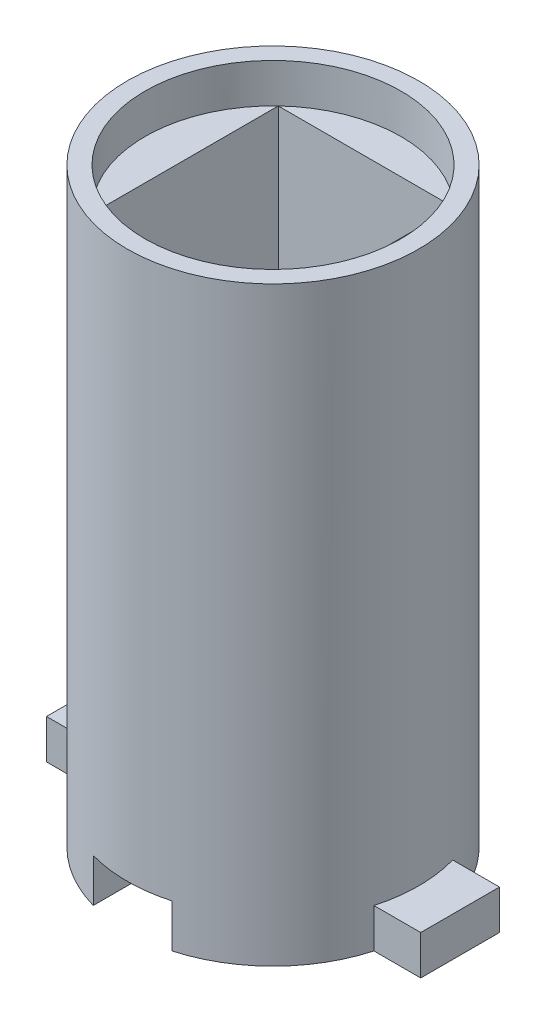
ISO-10303-21;
HEADER;
FILE_DESCRIPTION(('STEP AP214'),'2;1');
FILE_NAME('part.step','',(''),(''),'','','');
FILE_SCHEMA(('AUTOMOTIVE_DESIGN { 1 0 10303 214 1 1 1 1 }'));
ENDSEC;
DATA;
#1=APPLICATION_CONTEXT('core data for automotive mechanical design processes');
#2=APPLICATION_PROTOCOL_DEFINITION('international standard','automotive_design',2000,#1);
#3=PRODUCT_CONTEXT('',#1,'mechanical');
#4=PRODUCT('Part','Part','',(#3));
#5=PRODUCT_RELATED_PRODUCT_CATEGORY('part','',(#4));
#6=PRODUCT_DEFINITION_FORMATION('','',#4);
#7=PRODUCT_DEFINITION_CONTEXT('part definition',#1,'design');
#8=PRODUCT_DEFINITION('design','',#6,#7);
#9=PRODUCT_DEFINITION_SHAPE('','',#8);
#10=(LENGTH_UNIT() NAMED_UNIT(*) SI_UNIT(.MILLI.,.METRE.));
#11=(NAMED_UNIT(*) PLANE_ANGLE_UNIT() SI_UNIT($,.RADIAN.));
#12=(NAMED_UNIT(*) SI_UNIT($,.STERADIAN.) SOLID_ANGLE_UNIT());
#13=UNCERTAINTY_MEASURE_WITH_UNIT(LENGTH_MEASURE(1.E-05),#10,'distance_accuracy_value','');
#14=(GEOMETRIC_REPRESENTATION_CONTEXT(3) GLOBAL_UNCERTAINTY_ASSIGNED_CONTEXT((#13)) GLOBAL_UNIT_ASSIGNED_CONTEXT((#10,
#11,#12)) REPRESENTATION_CONTEXT('',''));
#15=CARTESIAN_POINT('',(0.,0.,0.));
#16=DIRECTION('',(0.,0.,1.));
#17=DIRECTION('',(1.,0.,0.));
#18=AXIS2_PLACEMENT_3D('',#15,#16,#17);
#19=CARTESIAN_POINT('',(0.,140.,0.));
#20=DIRECTION('',(0.,1.,0.));
#21=DIRECTION('',(0.,0.,1.));
#22=AXIS2_PLACEMENT_3D('',#19,#20,#21);
#23=PLANE('',#22);
#24=DIRECTION('',(0.,0.,-1.));
#25=VECTOR('',#24,1.);
#26=CARTESIAN_POINT('',(22.303644928014,140.,-23.6388963982051));
#27=LINE('',#26,#25);
#28=CARTESIAN_POINT('',(22.303644928014,140.,23.6388963982051));
#29=VERTEX_POINT('',#28);
#30=CARTESIAN_POINT('',(22.303644928014,140.,-23.6388963982051));
#31=VERTEX_POINT('',#30);
#32=EDGE_CURVE('E289',#29,#31,#27,.T.);
#33=ORIENTED_EDGE('',*,*,#32,.F.);
#34=CARTESIAN_POINT('',(0.,140.,0.));
#35=DIRECTION('',(0.,1.,0.));
#36=DIRECTION('',(0.,0.,1.));
#37=AXIS2_PLACEMENT_3D('',#34,#35,#36);
#38=CIRCLE('',#37,32.5);
#39=EDGE_CURVE('E322',#29,#31,#38,.T.);
#40=ORIENTED_EDGE('',*,*,#39,.T.);
#41=EDGE_LOOP('',(#33,#40));
#42=FACE_BOUND('',#41,.T.);
#43=ADVANCED_FACE('F39',(#42),#23,.T.);
#44=DIRECTION('',(1.,0.,0.));
#45=VECTOR('',#44,1.);
#46=CARTESIAN_POINT('',(-22.303644928014,140.,23.6388963982051));
#47=LINE('',#46,#45);
#48=CARTESIAN_POINT('',(-22.303644928014,140.,23.6388963982051));
#49=VERTEX_POINT('',#48);
#50=EDGE_CURVE('E294',#49,#29,#47,.T.);
#51=ORIENTED_EDGE('',*,*,#50,.F.);
#52=EDGE_CURVE('E327',#49,#29,#38,.T.);
#53=ORIENTED_EDGE('',*,*,#52,.T.);
#54=EDGE_LOOP('',(#51,#53));
#55=FACE_BOUND('',#54,.T.);
#56=ADVANCED_FACE('F457',(#55),#23,.T.);
#57=DIRECTION('',(0.,0.,1.));
#58=VECTOR('',#57,1.);
#59=CARTESIAN_POINT('',(-22.303644928014,140.,-23.6388963982051));
#60=LINE('',#59,#58);
#61=CARTESIAN_POINT('',(-22.303644928014,140.,-23.6388963982051));
#62=VERTEX_POINT('',#61);
#63=EDGE_CURVE('E308',#62,#49,#60,.T.);
#64=ORIENTED_EDGE('',*,*,#63,.F.);
#65=EDGE_CURVE('E491',#62,#49,#38,.T.);
#66=ORIENTED_EDGE('',*,*,#65,.T.);
#67=EDGE_LOOP('',(#64,#66));
#68=FACE_BOUND('',#67,.T.);
#69=ADVANCED_FACE('F464',(#68),#23,.T.);
#70=CARTESIAN_POINT('',(0.,150.,0.));
#71=DIRECTION('',(0.,-1.,0.));
#72=DIRECTION('',(0.,0.,-1.));
#73=AXIS2_PLACEMENT_3D('',#70,#71,#72);
#74=CYLINDRICAL_SURFACE('',#73,37.);
#75=CARTESIAN_POINT('',(0.,150.,0.));
#76=DIRECTION('',(0.,1.,0.));
#77=DIRECTION('',(0.,0.,1.));
#78=AXIS2_PLACEMENT_3D('',#75,#76,#77);
#79=CIRCLE('',#78,37.);
#80=CARTESIAN_POINT('',(0.,150.,37.));
#81=VERTEX_POINT('',#80);
#82=EDGE_CURVE('E347',#81,#81,#79,.T.);
#83=ORIENTED_EDGE('',*,*,#82,.F.);
#84=EDGE_LOOP('',(#83));
#85=FACE_BOUND('',#84,.T.);
#86=CARTESIAN_POINT('',(0.,11.,0.));
#87=DIRECTION('',(0.,-1.,0.));
#88=DIRECTION('',(0.,0.,-1.));
#89=AXIS2_PLACEMENT_3D('',#86,#87,#88);
#90=CIRCLE('',#89,37.);
#91=CARTESIAN_POINT('',(10.,11.,35.6230262611138));
#92=VERTEX_POINT('',#91);
#93=CARTESIAN_POINT('',(-10.,11.,35.6230262611138));
#94=VERTEX_POINT('',#93);
#95=EDGE_CURVE('E223',#92,#94,#90,.T.);
#96=ORIENTED_EDGE('',*,*,#95,.F.);
#97=DIRECTION('',(0.,-1.,0.));
#98=VECTOR('',#97,1.);
#99=CARTESIAN_POINT('',(10.,150.,35.6230262611138));
#100=LINE('',#99,#98);
#101=CARTESIAN_POINT('',(10.,0.,35.6230262611138));
#102=VERTEX_POINT('',#101);
#103=EDGE_CURVE('E207',#92,#102,#100,.T.);
#104=ORIENTED_EDGE('',*,*,#103,.T.);
#105=CARTESIAN_POINT('',(0.,0.,0.));
#106=DIRECTION('',(0.,1.,0.));
#107=DIRECTION('',(0.,0.,1.));
#108=AXIS2_PLACEMENT_3D('',#105,#106,#107);
#109=CIRCLE('',#108,37.);
#110=CARTESIAN_POINT('',(35.6230262611138,0.,10.));
#111=VERTEX_POINT('',#110);
#112=EDGE_CURVE('E339',#102,#111,#109,.T.);
#113=ORIENTED_EDGE('',*,*,#112,.T.);
#114=DIRECTION('',(0.,-1.,0.));
#115=VECTOR('',#114,1.);
#116=CARTESIAN_POINT('',(35.6230262611138,150.,10.));
#117=LINE('',#116,#115);
#118=CARTESIAN_POINT('',(35.6230262611138,10.,10.));
#119=VERTEX_POINT('',#118);
#120=EDGE_CURVE('E284',#111,#119,#117,.F.);
#121=ORIENTED_EDGE('',*,*,#120,.T.);
#122=CARTESIAN_POINT('',(0.,10.,0.));
#123=DIRECTION('',(0.,1.,0.));
#124=DIRECTION('',(0.,0.,1.));
#125=AXIS2_PLACEMENT_3D('',#122,#123,#124);
#126=CIRCLE('',#125,37.);
#127=CARTESIAN_POINT('',(35.6230262611138,10.,-10.));
#128=VERTEX_POINT('',#127);
#129=EDGE_CURVE('E280',#119,#128,#126,.T.);
#130=ORIENTED_EDGE('',*,*,#129,.T.);
#131=DIRECTION('',(0.,-1.,0.));
#132=VECTOR('',#131,1.);
#133=CARTESIAN_POINT('',(35.6230262611138,150.,-10.));
#134=LINE('',#133,#132);
#135=CARTESIAN_POINT('',(35.6230262611138,0.,-10.));
#136=VERTEX_POINT('',#135);
#137=EDGE_CURVE('E286',#128,#136,#134,.T.);
#138=ORIENTED_EDGE('',*,*,#137,.T.);
#139=CARTESIAN_POINT('',(-35.6230262611138,0.,-10.));
#140=VERTEX_POINT('',#139);
#141=EDGE_CURVE('E351',#136,#140,#109,.T.);
#142=ORIENTED_EDGE('',*,*,#141,.T.);
#143=DIRECTION('',(0.,-1.,0.));
#144=VECTOR('',#143,1.);
#145=CARTESIAN_POINT('',(-35.6230262611138,150.,-10.));
#146=LINE('',#145,#144);
#147=CARTESIAN_POINT('',(-35.6230262611138,10.,-10.));
#148=VERTEX_POINT('',#147);
#149=EDGE_CURVE('E63',#140,#148,#146,.F.);
#150=ORIENTED_EDGE('',*,*,#149,.T.);
#151=CARTESIAN_POINT('',(0.,10.,0.));
#152=DIRECTION('',(0.,-1.,0.));
#153=DIRECTION('',(0.,0.,-1.));
#154=AXIS2_PLACEMENT_3D('',#151,#152,#153);
#155=CIRCLE('',#154,37.);
#156=CARTESIAN_POINT('',(-35.6230262611138,10.,10.));
#157=VERTEX_POINT('',#156);
#158=EDGE_CURVE('E254',#157,#148,#155,.T.);
#159=ORIENTED_EDGE('',*,*,#158,.F.);
#160=DIRECTION('',(0.,-1.,0.));
#161=VECTOR('',#160,1.);
#162=CARTESIAN_POINT('',(-35.6230262611138,150.,10.));
#163=LINE('',#162,#161);
#164=CARTESIAN_POINT('',(-35.6230262611138,0.,10.));
#165=VERTEX_POINT('',#164);
#166=EDGE_CURVE('E258',#157,#165,#163,.T.);
#167=ORIENTED_EDGE('',*,*,#166,.T.);
#168=CARTESIAN_POINT('',(-10.,0.,35.6230262611138));
#169=VERTEX_POINT('',#168);
#170=EDGE_CURVE('E353',#165,#169,#109,.T.);
#171=ORIENTED_EDGE('',*,*,#170,.T.);
#172=DIRECTION('',(0.,-1.,0.));
#173=VECTOR('',#172,1.);
#174=CARTESIAN_POINT('',(-10.,150.,35.6230262611138));
#175=LINE('',#174,#173);
#176=EDGE_CURVE('E225',#169,#94,#175,.F.);
#177=ORIENTED_EDGE('',*,*,#176,.T.);
#178=EDGE_LOOP('',(#96,#104,#113,#121,#130,#138,#142,#150,#159,#167,#171,#177));
#179=FACE_BOUND('',#178,.T.);
#180=ADVANCED_FACE('F422',(#85,#179),#74,.T.);
#181=CARTESIAN_POINT('',(0.,150.,0.));
#182=DIRECTION('',(0.,1.,0.));
#183=DIRECTION('',(0.,0.,1.));
#184=AXIS2_PLACEMENT_3D('',#181,#182,#183);
#185=PLANE('',#184);
#186=CARTESIAN_POINT('',(0.,150.,0.));
#187=DIRECTION('',(0.,1.,0.));
#188=DIRECTION('',(0.,0.,1.));
#189=AXIS2_PLACEMENT_3D('',#186,#187,#188);
#190=CIRCLE('',#189,32.5);
#191=CARTESIAN_POINT('',(0.,150.,32.5));
#192=VERTEX_POINT('',#191);
#193=EDGE_CURVE('E315',#192,#192,#190,.T.);
#194=ORIENTED_EDGE('',*,*,#193,.F.);
#195=EDGE_LOOP('',(#194));
#196=FACE_BOUND('',#195,.T.);
#197=ORIENTED_EDGE('',*,*,#82,.T.);
#198=EDGE_LOOP('',(#197));
#199=FACE_BOUND('',#198,.T.);
#200=ADVANCED_FACE('F485',(#196,#199),#185,.T.);
#201=CARTESIAN_POINT('',(0.,0.,0.));
#202=DIRECTION('',(0.,1.,0.));
#203=DIRECTION('',(0.,0.,1.));
#204=AXIS2_PLACEMENT_3D('',#201,#202,#203);
#205=PLANE('',#204);
#206=ORIENTED_EDGE('',*,*,#112,.F.);
#207=DIRECTION('',(0.,0.,1.));
#208=VECTOR('',#207,1.);
#209=CARTESIAN_POINT('',(10.,0.,52.5));
#210=LINE('',#209,#208);
#211=CARTESIAN_POINT('',(10.,0.,21.5));
#212=VERTEX_POINT('',#211);
#213=EDGE_CURVE('E419',#212,#102,#210,.T.);
#214=ORIENTED_EDGE('',*,*,#213,.F.);
#215=DIRECTION('',(-1.,0.,0.));
#216=VECTOR('',#215,1.);
#217=CARTESIAN_POINT('',(-21.5,0.,21.5));
#218=LINE('',#217,#216);
#219=CARTESIAN_POINT('',(16.4999999999999,0.,21.5));
#220=VERTEX_POINT('',#219);
#221=EDGE_CURVE('E222',#220,#212,#218,.T.);
#222=ORIENTED_EDGE('',*,*,#221,.F.);
#223=DIRECTION('',(-0.707106781186551,0.,0.707106781186544));
#224=VECTOR('',#223,1.);
#225=CARTESIAN_POINT('',(18.9999999999999,0.,19.0000000000001));
#226=LINE('',#225,#224);
#227=CARTESIAN_POINT('',(21.5,0.,16.5));
#228=VERTEX_POINT('',#227);
#229=EDGE_CURVE('E384',#220,#228,#226,.F.);
#230=ORIENTED_EDGE('',*,*,#229,.T.);
#231=DIRECTION('',(0.,0.,1.));
#232=VECTOR('',#231,1.);
#233=CARTESIAN_POINT('',(21.5,0.,21.5));
#234=LINE('',#233,#232);
#235=CARTESIAN_POINT('',(21.5,0.,-16.5));
#236=VERTEX_POINT('',#235);
#237=EDGE_CURVE('E325',#236,#228,#234,.T.);
#238=ORIENTED_EDGE('',*,*,#237,.F.);
#239=DIRECTION('',(0.707106781186544,0.,0.707106781186551));
#240=VECTOR('',#239,1.);
#241=CARTESIAN_POINT('',(19.0000000000001,0.,-18.9999999999999));
#242=LINE('',#241,#240);
#243=CARTESIAN_POINT('',(16.5,0.,-21.5));
#244=VERTEX_POINT('',#243);
#245=EDGE_CURVE('E11',#236,#244,#242,.F.);
#246=ORIENTED_EDGE('',*,*,#245,.T.);
#247=DIRECTION('',(1.,0.,0.));
#248=VECTOR('',#247,1.);
#249=CARTESIAN_POINT('',(-21.5,0.,-21.5));
#250=LINE('',#249,#248);
#251=CARTESIAN_POINT('',(-16.4999999999999,0.,-21.5));
#252=VERTEX_POINT('',#251);
#253=EDGE_CURVE('E333',#252,#244,#250,.T.);
#254=ORIENTED_EDGE('',*,*,#253,.F.);
#255=DIRECTION('',(0.707106781186551,0.,-0.707106781186544));
#256=VECTOR('',#255,1.);
#257=CARTESIAN_POINT('',(-18.9999999999999,0.,-19.0000000000001));
#258=LINE('',#257,#256);
#259=CARTESIAN_POINT('',(-21.5,0.,-16.5));
#260=VERTEX_POINT('',#259);
#261=EDGE_CURVE('E48',#252,#260,#258,.F.);
#262=ORIENTED_EDGE('',*,*,#261,.T.);
#263=DIRECTION('',(0.,0.,-1.));
#264=VECTOR('',#263,1.);
#265=CARTESIAN_POINT('',(-21.5,0.,21.5));
#266=LINE('',#265,#264);
#267=CARTESIAN_POINT('',(-21.5,0.,16.5));
#268=VERTEX_POINT('',#267);
#269=EDGE_CURVE('E343',#268,#260,#266,.T.);
#270=ORIENTED_EDGE('',*,*,#269,.F.);
#271=DIRECTION('',(-0.707106781186544,0.,-0.707106781186551));
#272=VECTOR('',#271,1.);
#273=CARTESIAN_POINT('',(-19.0000000000001,0.,18.9999999999999));
#274=LINE('',#273,#272);
#275=CARTESIAN_POINT('',(-16.5,0.,21.5));
#276=VERTEX_POINT('',#275);
#277=EDGE_CURVE('E387',#268,#276,#274,.F.);
#278=ORIENTED_EDGE('',*,*,#277,.T.);
#279=CARTESIAN_POINT('',(-10.,0.,21.5));
#280=VERTEX_POINT('',#279);
#281=EDGE_CURVE('E341',#280,#276,#218,.T.);
#282=ORIENTED_EDGE('',*,*,#281,.F.);
#283=DIRECTION('',(0.,0.,-1.));
#284=VECTOR('',#283,1.);
#285=CARTESIAN_POINT('',(-10.,0.,52.5));
#286=LINE('',#285,#284);
#287=EDGE_CURVE('E211',#169,#280,#286,.T.);
#288=ORIENTED_EDGE('',*,*,#287,.F.);
#289=ORIENTED_EDGE('',*,*,#170,.F.);
#290=DIRECTION('',(-1.,0.,0.));
#291=VECTOR('',#290,1.);
#292=CARTESIAN_POINT('',(-47.5,0.,10.));
#293=LINE('',#292,#291);
#294=CARTESIAN_POINT('',(-47.5,0.,10.));
#295=VERTEX_POINT('',#294);
#296=EDGE_CURVE('E239',#165,#295,#293,.T.);
#297=ORIENTED_EDGE('',*,*,#296,.T.);
#298=DIRECTION('',(0.,0.,-1.));
#299=VECTOR('',#298,1.);
#300=CARTESIAN_POINT('',(-47.5,0.,10.));
#301=LINE('',#300,#299);
#302=CARTESIAN_POINT('',(-47.5,0.,-10.));
#303=VERTEX_POINT('',#302);
#304=EDGE_CURVE('E234',#295,#303,#301,.T.);
#305=ORIENTED_EDGE('',*,*,#304,.T.);
#306=DIRECTION('',(1.,0.,0.));
#307=VECTOR('',#306,1.);
#308=CARTESIAN_POINT('',(-47.5,0.,-10.));
#309=LINE('',#308,#307);
#310=EDGE_CURVE('E247',#303,#140,#309,.T.);
#311=ORIENTED_EDGE('',*,*,#310,.T.);
#312=ORIENTED_EDGE('',*,*,#141,.F.);
#313=DIRECTION('',(1.,0.,0.));
#314=VECTOR('',#313,1.);
#315=CARTESIAN_POINT('',(21.5,0.,-10.));
#316=LINE('',#315,#314);
#317=CARTESIAN_POINT('',(47.5,0.,-10.));
#318=VERTEX_POINT('',#317);
#319=EDGE_CURVE('E261',#136,#318,#316,.T.);
#320=ORIENTED_EDGE('',*,*,#319,.T.);
#321=DIRECTION('',(0.,0.,1.));
#322=VECTOR('',#321,1.);
#323=CARTESIAN_POINT('',(47.5,0.,10.));
#324=LINE('',#323,#322);
#325=CARTESIAN_POINT('',(47.5,0.,10.));
#326=VERTEX_POINT('',#325);
#327=EDGE_CURVE('E273',#318,#326,#324,.T.);
#328=ORIENTED_EDGE('',*,*,#327,.T.);
#329=DIRECTION('',(-1.,0.,0.));
#330=VECTOR('',#329,1.);
#331=CARTESIAN_POINT('',(21.5,0.,10.));
#332=LINE('',#331,#330);
#333=EDGE_CURVE('E265',#326,#111,#332,.T.);
#334=ORIENTED_EDGE('',*,*,#333,.T.);
#335=EDGE_LOOP('',(#206,#214,#222,#230,#238,#246,#254,#262,#270,#278,#282,#288,#289,#297,#305,
#311,#312,#320,#328,#334));
#336=FACE_BOUND('',#335,.T.);
#337=ADVANCED_FACE('F395',(#336),#205,.F.);
#338=CARTESIAN_POINT('',(21.5,36.,21.5));
#339=DIRECTION('',(1.,0.,0.));
#340=DIRECTION('',(0.,0.,-1.));
#341=AXIS2_PLACEMENT_3D('',#338,#339,#340);
#342=PLANE('',#341);
#343=ORIENTED_EDGE('',*,*,#237,.T.);
#344=DIRECTION('',(0.,1.,0.));
#345=VECTOR('',#344,1.);
#346=CARTESIAN_POINT('',(21.5,36.,16.5));
#347=LINE('',#346,#345);
#348=CARTESIAN_POINT('',(21.5,36.,16.5));
#349=VERTEX_POINT('',#348);
#350=EDGE_CURVE('E361',#228,#349,#347,.T.);
#351=ORIENTED_EDGE('',*,*,#350,.T.);
#352=DIRECTION('',(0.,0.,1.));
#353=VECTOR('',#352,1.);
#354=CARTESIAN_POINT('',(21.5,36.,21.5));
#355=LINE('',#354,#353);
#356=CARTESIAN_POINT('',(21.5,36.,-16.5));
#357=VERTEX_POINT('',#356);
#358=EDGE_CURVE('E330',#357,#349,#355,.T.);
#359=ORIENTED_EDGE('',*,*,#358,.F.);
#360=DIRECTION('',(0.,-1.,0.));
#361=VECTOR('',#360,1.);
#362=CARTESIAN_POINT('',(21.5,0.,-16.5));
#363=LINE('',#362,#361);
#364=EDGE_CURVE('E358',#357,#236,#363,.T.);
#365=ORIENTED_EDGE('',*,*,#364,.T.);
#366=EDGE_LOOP('',(#343,#351,#359,#365));
#367=FACE_BOUND('',#366,.T.);
#368=ADVANCED_FACE('F518',(#367),#342,.F.);
#369=CARTESIAN_POINT('',(-21.5,36.,-21.5));
#370=DIRECTION('',(0.,0.,-1.));
#371=DIRECTION('',(-1.,0.,0.));
#372=AXIS2_PLACEMENT_3D('',#369,#370,#371);
#373=PLANE('',#372);
#374=DIRECTION('',(1.,0.,0.));
#375=VECTOR('',#374,1.);
#376=CARTESIAN_POINT('',(-21.5,36.,-21.5));
#377=LINE('',#376,#375);
#378=CARTESIAN_POINT('',(-16.4999999999999,36.,-21.5));
#379=VERTEX_POINT('',#378);
#380=CARTESIAN_POINT('',(16.5,36.,-21.5));
#381=VERTEX_POINT('',#380);
#382=EDGE_CURVE('E337',#379,#381,#377,.T.);
#383=ORIENTED_EDGE('',*,*,#382,.F.);
#384=DIRECTION('',(0.,-1.,0.));
#385=VECTOR('',#384,1.);
#386=CARTESIAN_POINT('',(-16.4999999999999,0.,-21.5));
#387=LINE('',#386,#385);
#388=EDGE_CURVE('E381',#379,#252,#387,.T.);
#389=ORIENTED_EDGE('',*,*,#388,.T.);
#390=ORIENTED_EDGE('',*,*,#253,.T.);
#391=DIRECTION('',(0.,1.,0.));
#392=VECTOR('',#391,1.);
#393=CARTESIAN_POINT('',(16.5,36.,-21.5));
#394=LINE('',#393,#392);
#395=EDGE_CURVE('E378',#244,#381,#394,.T.);
#396=ORIENTED_EDGE('',*,*,#395,.T.);
#397=EDGE_LOOP('',(#383,#389,#390,#396));
#398=FACE_BOUND('',#397,.T.);
#399=ADVANCED_FACE('F512',(#398),#373,.F.);
#400=CARTESIAN_POINT('',(-21.5,36.,21.5));
#401=DIRECTION('',(-1.,0.,0.));
#402=DIRECTION('',(0.,0.,1.));
#403=AXIS2_PLACEMENT_3D('',#400,#401,#402);
#404=PLANE('',#403);
#405=ORIENTED_EDGE('',*,*,#269,.T.);
#406=DIRECTION('',(0.,1.,0.));
#407=VECTOR('',#406,1.);
#408=CARTESIAN_POINT('',(-21.5,36.,-16.5));
#409=LINE('',#408,#407);
#410=CARTESIAN_POINT('',(-21.5,36.,-16.5));
#411=VERTEX_POINT('',#410);
#412=EDGE_CURVE('E372',#260,#411,#409,.T.);
#413=ORIENTED_EDGE('',*,*,#412,.T.);
#414=DIRECTION('',(0.,0.,-1.));
#415=VECTOR('',#414,1.);
#416=CARTESIAN_POINT('',(-21.5,36.,21.5));
#417=LINE('',#416,#415);
#418=CARTESIAN_POINT('',(-21.5,36.,16.5));
#419=VERTEX_POINT('',#418);
#420=EDGE_CURVE('E335',#419,#411,#417,.T.);
#421=ORIENTED_EDGE('',*,*,#420,.F.);
#422=DIRECTION('',(0.,-1.,0.));
#423=VECTOR('',#422,1.);
#424=CARTESIAN_POINT('',(-21.5,0.,16.5));
#425=LINE('',#424,#423);
#426=EDGE_CURVE('E375',#419,#268,#425,.T.);
#427=ORIENTED_EDGE('',*,*,#426,.T.);
#428=EDGE_LOOP('',(#405,#413,#421,#427));
#429=FACE_BOUND('',#428,.T.);
#430=ADVANCED_FACE('F402',(#429),#404,.F.);
#431=CARTESIAN_POINT('',(-21.5,36.,21.5));
#432=DIRECTION('',(0.,0.,1.));
#433=DIRECTION('',(1.,0.,0.));
#434=AXIS2_PLACEMENT_3D('',#431,#432,#433);
#435=PLANE('',#434);
#436=ORIENTED_EDGE('',*,*,#221,.T.);
#437=DIRECTION('',(0.,-1.,0.));
#438=VECTOR('',#437,1.);
#439=CARTESIAN_POINT('',(10.,11.,21.5));
#440=LINE('',#439,#438);
#441=CARTESIAN_POINT('',(10.,11.,21.5));
#442=VERTEX_POINT('',#441);
#443=EDGE_CURVE('E204',#442,#212,#440,.T.);
#444=ORIENTED_EDGE('',*,*,#443,.F.);
#445=DIRECTION('',(1.,0.,0.));
#446=VECTOR('',#445,1.);
#447=CARTESIAN_POINT('',(-10.,11.,21.5));
#448=LINE('',#447,#446);
#449=CARTESIAN_POINT('',(-10.,11.,21.5));
#450=VERTEX_POINT('',#449);
#451=EDGE_CURVE('E214',#450,#442,#448,.T.);
#452=ORIENTED_EDGE('',*,*,#451,.F.);
#453=DIRECTION('',(0.,-1.,0.));
#454=VECTOR('',#453,1.);
#455=CARTESIAN_POINT('',(-10.,11.,21.5));
#456=LINE('',#455,#454);
#457=EDGE_CURVE('E55',#450,#280,#456,.T.);
#458=ORIENTED_EDGE('',*,*,#457,.T.);
#459=ORIENTED_EDGE('',*,*,#281,.T.);
#460=DIRECTION('',(0.,1.,0.));
#461=VECTOR('',#460,1.);
#462=CARTESIAN_POINT('',(-16.5,36.,21.5));
#463=LINE('',#462,#461);
#464=CARTESIAN_POINT('',(-16.5,36.,21.5));
#465=VERTEX_POINT('',#464);
#466=EDGE_CURVE('E350',#276,#465,#463,.T.);
#467=ORIENTED_EDGE('',*,*,#466,.T.);
#468=DIRECTION('',(-1.,0.,0.));
#469=VECTOR('',#468,1.);
#470=CARTESIAN_POINT('',(-21.5,36.,21.5));
#471=LINE('',#470,#469);
#472=CARTESIAN_POINT('',(16.4999999999999,36.,21.5));
#473=VERTEX_POINT('',#472);
#474=EDGE_CURVE('E332',#473,#465,#471,.T.);
#475=ORIENTED_EDGE('',*,*,#474,.F.);
#476=DIRECTION('',(0.,-1.,0.));
#477=VECTOR('',#476,1.);
#478=CARTESIAN_POINT('',(16.4999999999999,0.,21.5));
#479=LINE('',#478,#477);
#480=EDGE_CURVE('E356',#473,#220,#479,.T.);
#481=ORIENTED_EDGE('',*,*,#480,.T.);
#482=EDGE_LOOP('',(#436,#444,#452,#458,#459,#467,#475,#481));
#483=FACE_BOUND('',#482,.T.);
#484=ADVANCED_FACE('F219',(#483),#435,.F.);
#485=CARTESIAN_POINT('',(16.4999999999999,36.,21.5));
#486=DIRECTION('',(-0.707106781186543,0.,-0.707106781186551));
#487=DIRECTION('',(0.,1.,0.));
#488=AXIS2_PLACEMENT_3D('',#485,#486,#487);
#489=PLANE('',#488);
#490=DIRECTION('',(0.707106781186551,0.,-0.707106781186544));
#491=VECTOR('',#490,1.);
#492=CARTESIAN_POINT('',(18.9999999999999,36.,19.0000000000001));
#493=LINE('',#492,#491);
#494=EDGE_CURVE('E370',#349,#473,#493,.F.);
#495=ORIENTED_EDGE('',*,*,#494,.F.);
#496=ORIENTED_EDGE('',*,*,#350,.F.);
#497=ORIENTED_EDGE('',*,*,#229,.F.);
#498=ORIENTED_EDGE('',*,*,#480,.F.);
#499=EDGE_LOOP('',(#495,#496,#497,#498));
#500=FACE_BOUND('',#499,.T.);
#501=ADVANCED_FACE('F416',(#500),#489,.T.);
#502=CARTESIAN_POINT('',(-21.5,36.,16.5));
#503=DIRECTION('',(0.707106781186551,0.,-0.707106781186544));
#504=DIRECTION('',(0.,1.,0.));
#505=AXIS2_PLACEMENT_3D('',#502,#503,#504);
#506=PLANE('',#505);
#507=DIRECTION('',(0.707106781186544,0.,0.707106781186551));
#508=VECTOR('',#507,1.);
#509=CARTESIAN_POINT('',(-19.0000000000001,36.,18.9999999999999));
#510=LINE('',#509,#508);
#511=EDGE_CURVE('E368',#465,#419,#510,.F.);
#512=ORIENTED_EDGE('',*,*,#511,.F.);
#513=ORIENTED_EDGE('',*,*,#466,.F.);
#514=ORIENTED_EDGE('',*,*,#277,.F.);
#515=ORIENTED_EDGE('',*,*,#426,.F.);
#516=EDGE_LOOP('',(#512,#513,#514,#515));
#517=FACE_BOUND('',#516,.T.);
#518=ADVANCED_FACE('F406',(#517),#506,.T.);
#519=CARTESIAN_POINT('',(-16.4999999999999,36.,-21.5));
#520=DIRECTION('',(0.707106781186543,0.,0.707106781186551));
#521=DIRECTION('',(0.,1.,0.));
#522=AXIS2_PLACEMENT_3D('',#519,#520,#521);
#523=PLANE('',#522);
#524=DIRECTION('',(-0.707106781186551,0.,0.707106781186544));
#525=VECTOR('',#524,1.);
#526=CARTESIAN_POINT('',(-18.9999999999999,36.,-19.0000000000001));
#527=LINE('',#526,#525);
#528=EDGE_CURVE('E366',#411,#379,#527,.F.);
#529=ORIENTED_EDGE('',*,*,#528,.F.);
#530=ORIENTED_EDGE('',*,*,#412,.F.);
#531=ORIENTED_EDGE('',*,*,#261,.F.);
#532=ORIENTED_EDGE('',*,*,#388,.F.);
#533=EDGE_LOOP('',(#529,#530,#531,#532));
#534=FACE_BOUND('',#533,.T.);
#535=ADVANCED_FACE('F399',(#534),#523,.T.);
#536=CARTESIAN_POINT('',(21.5,36.,-16.5));
#537=DIRECTION('',(-0.707106781186551,0.,0.707106781186544));
#538=DIRECTION('',(0.,1.,0.));
#539=AXIS2_PLACEMENT_3D('',#536,#537,#538);
#540=PLANE('',#539);
#541=DIRECTION('',(-0.707106781186544,0.,-0.707106781186551));
#542=VECTOR('',#541,1.);
#543=CARTESIAN_POINT('',(19.0000000000001,36.,-18.9999999999999));
#544=LINE('',#543,#542);
#545=EDGE_CURVE('E364',#381,#357,#544,.F.);
#546=ORIENTED_EDGE('',*,*,#545,.F.);
#547=ORIENTED_EDGE('',*,*,#395,.F.);
#548=ORIENTED_EDGE('',*,*,#245,.F.);
#549=ORIENTED_EDGE('',*,*,#364,.F.);
#550=EDGE_LOOP('',(#546,#547,#548,#549));
#551=FACE_BOUND('',#550,.T.);
#552=ADVANCED_FACE('F42',(#551),#540,.T.);
#553=DIRECTION('',(-1.,0.,0.));
#554=VECTOR('',#553,1.);
#555=CARTESIAN_POINT('',(-22.303644928014,140.,-23.6388963982051));
#556=LINE('',#555,#554);
#557=EDGE_CURVE('E305',#31,#62,#556,.T.);
#558=ORIENTED_EDGE('',*,*,#557,.F.);
#559=EDGE_CURVE('E326',#31,#62,#38,.T.);
#560=ORIENTED_EDGE('',*,*,#559,.T.);
#561=EDGE_LOOP('',(#558,#560));
#562=FACE_BOUND('',#561,.T.);
#563=ADVANCED_FACE('F460',(#562),#23,.T.);
#564=CARTESIAN_POINT('',(0.,140.,0.));
#565=DIRECTION('',(0.,1.,0.));
#566=DIRECTION('',(0.,0.,1.));
#567=AXIS2_PLACEMENT_3D('',#564,#565,#566);
#568=CYLINDRICAL_SURFACE('',#567,32.5);
#569=ORIENTED_EDGE('',*,*,#39,.F.);
#570=ORIENTED_EDGE('',*,*,#52,.F.);
#571=ORIENTED_EDGE('',*,*,#65,.F.);
#572=ORIENTED_EDGE('',*,*,#559,.F.);
#573=EDGE_LOOP('',(#569,#570,#571,#572));
#574=FACE_BOUND('',#573,.T.);
#575=ORIENTED_EDGE('',*,*,#193,.T.);
#576=EDGE_LOOP('',(#575));
#577=FACE_BOUND('',#576,.T.);
#578=ADVANCED_FACE('F470',(#574,#577),#568,.F.);
#579=CARTESIAN_POINT('',(0.,36.,0.));
#580=DIRECTION('',(0.,1.,0.));
#581=DIRECTION('',(0.,0.,1.));
#582=AXIS2_PLACEMENT_3D('',#579,#580,#581);
#583=PLANE('',#582);
#584=DIRECTION('',(0.,0.,-1.));
#585=VECTOR('',#584,1.);
#586=CARTESIAN_POINT('',(22.303644928014,36.,-23.6388963982051));
#587=LINE('',#586,#585);
#588=CARTESIAN_POINT('',(22.303644928014,36.,23.6388963982051));
#589=VERTEX_POINT('',#588);
#590=CARTESIAN_POINT('',(22.303644928014,36.,-23.6388963982051));
#591=VERTEX_POINT('',#590);
#592=EDGE_CURVE('E290',#589,#591,#587,.T.);
#593=ORIENTED_EDGE('',*,*,#592,.T.);
#594=DIRECTION('',(-1.,0.,0.));
#595=VECTOR('',#594,1.);
#596=CARTESIAN_POINT('',(-22.303644928014,36.,-23.6388963982051));
#597=LINE('',#596,#595);
#598=CARTESIAN_POINT('',(-22.303644928014,36.,-23.6388963982051));
#599=VERTEX_POINT('',#598);
#600=EDGE_CURVE('E293',#591,#599,#597,.T.);
#601=ORIENTED_EDGE('',*,*,#600,.T.);
#602=DIRECTION('',(0.,0.,1.));
#603=VECTOR('',#602,1.);
#604=CARTESIAN_POINT('',(-22.303644928014,36.,-23.6388963982051));
#605=LINE('',#604,#603);
#606=CARTESIAN_POINT('',(-22.303644928014,36.,23.6388963982051));
#607=VERTEX_POINT('',#606);
#608=EDGE_CURVE('E297',#599,#607,#605,.T.);
#609=ORIENTED_EDGE('',*,*,#608,.T.);
#610=DIRECTION('',(1.,0.,0.));
#611=VECTOR('',#610,1.);
#612=CARTESIAN_POINT('',(-22.303644928014,36.,23.6388963982051));
#613=LINE('',#612,#611);
#614=EDGE_CURVE('E300',#607,#589,#613,.T.);
#615=ORIENTED_EDGE('',*,*,#614,.T.);
#616=EDGE_LOOP('',(#593,#601,#609,#615));
#617=FACE_BOUND('',#616,.T.);
#618=ORIENTED_EDGE('',*,*,#511,.T.);
#619=ORIENTED_EDGE('',*,*,#420,.T.);
#620=ORIENTED_EDGE('',*,*,#528,.T.);
#621=ORIENTED_EDGE('',*,*,#382,.T.);
#622=ORIENTED_EDGE('',*,*,#545,.T.);
#623=ORIENTED_EDGE('',*,*,#358,.T.);
#624=ORIENTED_EDGE('',*,*,#494,.T.);
#625=ORIENTED_EDGE('',*,*,#474,.T.);
#626=EDGE_LOOP('',(#618,#619,#620,#621,#622,#623,#624,#625));
#627=FACE_BOUND('',#626,.T.);
#628=ADVANCED_FACE('F476',(#617,#627),#583,.T.);
#629=CARTESIAN_POINT('',(22.303644928014,36.,-23.6388963982051));
#630=DIRECTION('',(1.,0.,0.));
#631=DIRECTION('',(0.,0.,-1.));
#632=AXIS2_PLACEMENT_3D('',#629,#630,#631);
#633=PLANE('',#632);
#634=ORIENTED_EDGE('',*,*,#32,.T.);
#635=DIRECTION('',(0.,1.,0.));
#636=VECTOR('',#635,1.);
#637=CARTESIAN_POINT('',(22.303644928014,36.,-23.6388963982051));
#638=LINE('',#637,#636);
#639=EDGE_CURVE('E303',#591,#31,#638,.T.);
#640=ORIENTED_EDGE('',*,*,#639,.F.);
#641=ORIENTED_EDGE('',*,*,#592,.F.);
#642=DIRECTION('',(0.,1.,0.));
#643=VECTOR('',#642,1.);
#644=CARTESIAN_POINT('',(22.303644928014,36.,23.6388963982051));
#645=LINE('',#644,#643);
#646=EDGE_CURVE('E313',#589,#29,#645,.T.);
#647=ORIENTED_EDGE('',*,*,#646,.T.);
#648=EDGE_LOOP('',(#634,#640,#641,#647));
#649=FACE_BOUND('',#648,.T.);
#650=ADVANCED_FACE('F504',(#649),#633,.F.);
#651=CARTESIAN_POINT('',(-22.303644928014,36.,23.6388963982051));
#652=DIRECTION('',(0.,0.,1.));
#653=DIRECTION('',(1.,0.,0.));
#654=AXIS2_PLACEMENT_3D('',#651,#652,#653);
#655=PLANE('',#654);
#656=ORIENTED_EDGE('',*,*,#50,.T.);
#657=ORIENTED_EDGE('',*,*,#646,.F.);
#658=ORIENTED_EDGE('',*,*,#614,.F.);
#659=DIRECTION('',(0.,1.,0.));
#660=VECTOR('',#659,1.);
#661=CARTESIAN_POINT('',(-22.303644928014,36.,23.6388963982051));
#662=LINE('',#661,#660);
#663=EDGE_CURVE('E316',#607,#49,#662,.T.);
#664=ORIENTED_EDGE('',*,*,#663,.T.);
#665=EDGE_LOOP('',(#656,#657,#658,#664));
#666=FACE_BOUND('',#665,.T.);
#667=ADVANCED_FACE('F506',(#666),#655,.F.);
#668=CARTESIAN_POINT('',(-22.303644928014,36.,-23.6388963982051));
#669=DIRECTION('',(-1.,0.,0.));
#670=DIRECTION('',(0.,0.,1.));
#671=AXIS2_PLACEMENT_3D('',#668,#669,#670);
#672=PLANE('',#671);
#673=ORIENTED_EDGE('',*,*,#63,.T.);
#674=ORIENTED_EDGE('',*,*,#663,.F.);
#675=ORIENTED_EDGE('',*,*,#608,.F.);
#676=DIRECTION('',(0.,1.,0.));
#677=VECTOR('',#676,1.);
#678=CARTESIAN_POINT('',(-22.303644928014,36.,-23.6388963982051));
#679=LINE('',#678,#677);
#680=EDGE_CURVE('E318',#599,#62,#679,.T.);
#681=ORIENTED_EDGE('',*,*,#680,.T.);
#682=EDGE_LOOP('',(#673,#674,#675,#681));
#683=FACE_BOUND('',#682,.T.);
#684=ADVANCED_FACE('F451',(#683),#672,.F.);
#685=CARTESIAN_POINT('',(-22.303644928014,36.,-23.6388963982051));
#686=DIRECTION('',(0.,0.,-1.));
#687=DIRECTION('',(-1.,0.,0.));
#688=AXIS2_PLACEMENT_3D('',#685,#686,#687);
#689=PLANE('',#688);
#690=ORIENTED_EDGE('',*,*,#557,.T.);
#691=ORIENTED_EDGE('',*,*,#680,.F.);
#692=ORIENTED_EDGE('',*,*,#600,.F.);
#693=ORIENTED_EDGE('',*,*,#639,.T.);
#694=EDGE_LOOP('',(#690,#691,#692,#693));
#695=FACE_BOUND('',#694,.T.);
#696=ADVANCED_FACE('F444',(#695),#689,.F.);
#697=CARTESIAN_POINT('',(21.5,10.,-10.));
#698=DIRECTION('',(0.,0.,-1.));
#699=DIRECTION('',(-1.,0.,0.));
#700=AXIS2_PLACEMENT_3D('',#697,#698,#699);
#701=PLANE('',#700);
#702=ORIENTED_EDGE('',*,*,#137,.F.);
#703=DIRECTION('',(1.,0.,0.));
#704=VECTOR('',#703,1.);
#705=CARTESIAN_POINT('',(21.5,10.,-10.));
#706=LINE('',#705,#704);
#707=CARTESIAN_POINT('',(47.5,10.,-10.));
#708=VERTEX_POINT('',#707);
#709=EDGE_CURVE('E262',#128,#708,#706,.T.);
#710=ORIENTED_EDGE('',*,*,#709,.T.);
#711=DIRECTION('',(0.,-1.,0.));
#712=VECTOR('',#711,1.);
#713=CARTESIAN_POINT('',(47.5,10.,-10.));
#714=LINE('',#713,#712);
#715=EDGE_CURVE('E271',#708,#318,#714,.T.);
#716=ORIENTED_EDGE('',*,*,#715,.T.);
#717=ORIENTED_EDGE('',*,*,#319,.F.);
#718=EDGE_LOOP('',(#702,#710,#716,#717));
#719=FACE_BOUND('',#718,.T.);
#720=ADVANCED_FACE('F442',(#719),#701,.T.);
#721=CARTESIAN_POINT('',(21.5,10.,10.));
#722=DIRECTION('',(0.,0.,1.));
#723=DIRECTION('',(1.,0.,0.));
#724=AXIS2_PLACEMENT_3D('',#721,#722,#723);
#725=PLANE('',#724);
#726=ORIENTED_EDGE('',*,*,#120,.F.);
#727=ORIENTED_EDGE('',*,*,#333,.F.);
#728=DIRECTION('',(0.,-1.,0.));
#729=VECTOR('',#728,1.);
#730=CARTESIAN_POINT('',(47.5,10.,10.));
#731=LINE('',#730,#729);
#732=CARTESIAN_POINT('',(47.5,10.,10.));
#733=VERTEX_POINT('',#732);
#734=EDGE_CURVE('E278',#733,#326,#731,.T.);
#735=ORIENTED_EDGE('',*,*,#734,.F.);
#736=DIRECTION('',(-1.,0.,0.));
#737=VECTOR('',#736,1.);
#738=CARTESIAN_POINT('',(21.5,10.,10.));
#739=LINE('',#738,#737);
#740=EDGE_CURVE('E268',#733,#119,#739,.T.);
#741=ORIENTED_EDGE('',*,*,#740,.T.);
#742=EDGE_LOOP('',(#726,#727,#735,#741));
#743=FACE_BOUND('',#742,.T.);
#744=ADVANCED_FACE('F429',(#743),#725,.T.);
#745=CARTESIAN_POINT('',(0.,10.,0.));
#746=DIRECTION('',(0.,1.,0.));
#747=DIRECTION('',(0.,0.,1.));
#748=AXIS2_PLACEMENT_3D('',#745,#746,#747);
#749=PLANE('',#748);
#750=ORIENTED_EDGE('',*,*,#129,.F.);
#751=ORIENTED_EDGE('',*,*,#740,.F.);
#752=DIRECTION('',(0.,0.,1.));
#753=VECTOR('',#752,1.);
#754=CARTESIAN_POINT('',(47.5,10.,10.));
#755=LINE('',#754,#753);
#756=EDGE_CURVE('E264',#708,#733,#755,.T.);
#757=ORIENTED_EDGE('',*,*,#756,.F.);
#758=ORIENTED_EDGE('',*,*,#709,.F.);
#759=EDGE_LOOP('',(#750,#751,#757,#758));
#760=FACE_BOUND('',#759,.T.);
#761=ADVANCED_FACE('F438',(#760),#749,.T.);
#762=CARTESIAN_POINT('',(47.5,10.,10.));
#763=DIRECTION('',(1.,0.,0.));
#764=DIRECTION('',(0.,0.,-1.));
#765=AXIS2_PLACEMENT_3D('',#762,#763,#764);
#766=PLANE('',#765);
#767=ORIENTED_EDGE('',*,*,#327,.F.);
#768=ORIENTED_EDGE('',*,*,#715,.F.);
#769=ORIENTED_EDGE('',*,*,#756,.T.);
#770=ORIENTED_EDGE('',*,*,#734,.T.);
#771=EDGE_LOOP('',(#767,#768,#769,#770));
#772=FACE_BOUND('',#771,.T.);
#773=ADVANCED_FACE('F435',(#772),#766,.T.);
#774=CARTESIAN_POINT('',(-47.5,10.,10.));
#775=DIRECTION('',(0.,0.,1.));
#776=DIRECTION('',(1.,0.,0.));
#777=AXIS2_PLACEMENT_3D('',#774,#775,#776);
#778=PLANE('',#777);
#779=ORIENTED_EDGE('',*,*,#166,.F.);
#780=DIRECTION('',(-1.,0.,0.));
#781=VECTOR('',#780,1.);
#782=CARTESIAN_POINT('',(-47.5,10.,10.));
#783=LINE('',#782,#781);
#784=CARTESIAN_POINT('',(-47.5,10.,10.));
#785=VERTEX_POINT('',#784);
#786=EDGE_CURVE('E242',#157,#785,#783,.T.);
#787=ORIENTED_EDGE('',*,*,#786,.T.);
#788=DIRECTION('',(0.,-1.,0.));
#789=VECTOR('',#788,1.);
#790=CARTESIAN_POINT('',(-47.5,10.,10.));
#791=LINE('',#790,#789);
#792=EDGE_CURVE('E251',#785,#295,#791,.T.);
#793=ORIENTED_EDGE('',*,*,#792,.T.);
#794=ORIENTED_EDGE('',*,*,#296,.F.);
#795=EDGE_LOOP('',(#779,#787,#793,#794));
#796=FACE_BOUND('',#795,.T.);
#797=ADVANCED_FACE('F645',(#796),#778,.T.);
#798=CARTESIAN_POINT('',(-47.5,10.,-10.));
#799=DIRECTION('',(0.,0.,-1.));
#800=DIRECTION('',(-1.,0.,0.));
#801=AXIS2_PLACEMENT_3D('',#798,#799,#800);
#802=PLANE('',#801);
#803=ORIENTED_EDGE('',*,*,#149,.F.);
#804=ORIENTED_EDGE('',*,*,#310,.F.);
#805=DIRECTION('',(0.,-1.,0.));
#806=VECTOR('',#805,1.);
#807=CARTESIAN_POINT('',(-47.5,10.,-10.));
#808=LINE('',#807,#806);
#809=CARTESIAN_POINT('',(-47.5,10.,-10.));
#810=VERTEX_POINT('',#809);
#811=EDGE_CURVE('E244',#810,#303,#808,.T.);
#812=ORIENTED_EDGE('',*,*,#811,.F.);
#813=DIRECTION('',(1.,0.,0.));
#814=VECTOR('',#813,1.);
#815=CARTESIAN_POINT('',(-47.5,10.,-10.));
#816=LINE('',#815,#814);
#817=EDGE_CURVE('E238',#810,#148,#816,.T.);
#818=ORIENTED_EDGE('',*,*,#817,.T.);
#819=EDGE_LOOP('',(#803,#804,#812,#818));
#820=FACE_BOUND('',#819,.T.);
#821=ADVANCED_FACE('F653',(#820),#802,.T.);
#822=CARTESIAN_POINT('',(0.,10.,0.));
#823=DIRECTION('',(0.,-1.,0.));
#824=DIRECTION('',(0.,0.,-1.));
#825=AXIS2_PLACEMENT_3D('',#822,#823,#824);
#826=PLANE('',#825);
#827=ORIENTED_EDGE('',*,*,#786,.F.);
#828=ORIENTED_EDGE('',*,*,#158,.T.);
#829=ORIENTED_EDGE('',*,*,#817,.F.);
#830=DIRECTION('',(0.,0.,-1.));
#831=VECTOR('',#830,1.);
#832=CARTESIAN_POINT('',(-47.5,10.,10.));
#833=LINE('',#832,#831);
#834=EDGE_CURVE('E235',#785,#810,#833,.T.);
#835=ORIENTED_EDGE('',*,*,#834,.F.);
#836=EDGE_LOOP('',(#827,#828,#829,#835));
#837=FACE_BOUND('',#836,.T.);
#838=ADVANCED_FACE('F663',(#837),#826,.F.);
#839=CARTESIAN_POINT('',(-47.5,10.,10.));
#840=DIRECTION('',(-1.,0.,0.));
#841=DIRECTION('',(0.,0.,1.));
#842=AXIS2_PLACEMENT_3D('',#839,#840,#841);
#843=PLANE('',#842);
#844=ORIENTED_EDGE('',*,*,#304,.F.);
#845=ORIENTED_EDGE('',*,*,#792,.F.);
#846=ORIENTED_EDGE('',*,*,#834,.T.);
#847=ORIENTED_EDGE('',*,*,#811,.T.);
#848=EDGE_LOOP('',(#844,#845,#846,#847));
#849=FACE_BOUND('',#848,.T.);
#850=ADVANCED_FACE('F673',(#849),#843,.T.);
#851=CARTESIAN_POINT('',(10.,11.,52.5));
#852=DIRECTION('',(1.,0.,0.));
#853=DIRECTION('',(0.,0.,-1.));
#854=AXIS2_PLACEMENT_3D('',#851,#852,#853);
#855=PLANE('',#854);
#856=DIRECTION('',(0.,0.,1.));
#857=VECTOR('',#856,1.);
#858=CARTESIAN_POINT('',(10.,11.,52.5));
#859=LINE('',#858,#857);
#860=EDGE_CURVE('E200',#442,#92,#859,.T.);
#861=ORIENTED_EDGE('',*,*,#860,.F.);
#862=ORIENTED_EDGE('',*,*,#443,.T.);
#863=ORIENTED_EDGE('',*,*,#213,.T.);
#864=ORIENTED_EDGE('',*,*,#103,.F.);
#865=EDGE_LOOP('',(#861,#862,#863,#864));
#866=FACE_BOUND('',#865,.T.);
#867=ADVANCED_FACE('F202',(#866),#855,.F.);
#868=CARTESIAN_POINT('',(-10.,11.,52.5));
#869=DIRECTION('',(-1.,0.,0.));
#870=DIRECTION('',(0.,0.,1.));
#871=AXIS2_PLACEMENT_3D('',#868,#869,#870);
#872=PLANE('',#871);
#873=ORIENTED_EDGE('',*,*,#287,.T.);
#874=ORIENTED_EDGE('',*,*,#457,.F.);
#875=DIRECTION('',(0.,0.,-1.));
#876=VECTOR('',#875,1.);
#877=CARTESIAN_POINT('',(-10.,11.,52.5));
#878=LINE('',#877,#876);
#879=EDGE_CURVE('E210',#94,#450,#878,.T.);
#880=ORIENTED_EDGE('',*,*,#879,.F.);
#881=ORIENTED_EDGE('',*,*,#176,.F.);
#882=EDGE_LOOP('',(#873,#874,#880,#881));
#883=FACE_BOUND('',#882,.T.);
#884=ADVANCED_FACE('F421',(#883),#872,.F.);
#885=CARTESIAN_POINT('',(0.,11.,0.));
#886=DIRECTION('',(0.,-1.,0.));
#887=DIRECTION('',(0.,0.,-1.));
#888=AXIS2_PLACEMENT_3D('',#885,#886,#887);
#889=PLANE('',#888);
#890=ORIENTED_EDGE('',*,*,#95,.T.);
#891=ORIENTED_EDGE('',*,*,#879,.T.);
#892=ORIENTED_EDGE('',*,*,#451,.T.);
#893=ORIENTED_EDGE('',*,*,#860,.T.);
#894=EDGE_LOOP('',(#890,#891,#892,#893));
#895=FACE_BOUND('',#894,.T.);
#896=ADVANCED_FACE('F215',(#895),#889,.T.);
#897=CLOSED_SHELL('',(#43,#56,#69,#180,#200,#337,#368,#399,#430,#484,#501,#518,#535,#552,#563,
#578,#628,#650,#667,#684,#696,#720,#744,#761,#773,#797,#821,#838,#850,#867,#884,#896));
#898=MANIFOLD_SOLID_BREP('B2',#897);
#899=ADVANCED_BREP_SHAPE_REPRESENTATION('',(#18,#898),#14);
#900=SHAPE_DEFINITION_REPRESENTATION(#9,#899);
ENDSEC;
END-ISO-10303-21;
